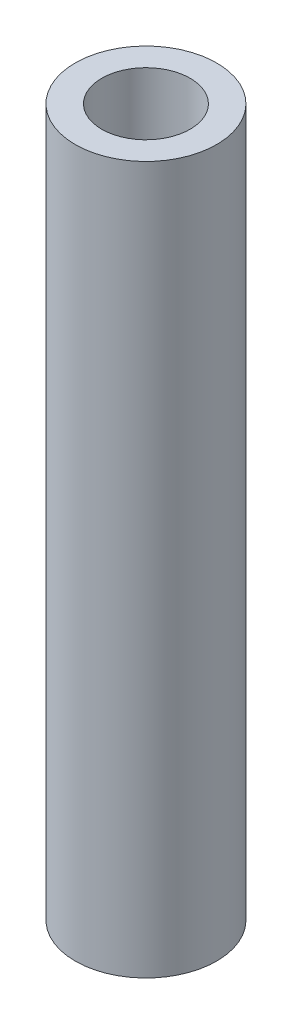
ISO-10303-21;
HEADER;
FILE_DESCRIPTION(('STEP AP214'),'2;1');
FILE_NAME('part.step','',(''),(''),'','','');
FILE_SCHEMA(('AUTOMOTIVE_DESIGN { 1 0 10303 214 1 1 1 1 }'));
ENDSEC;
DATA;
#1=APPLICATION_CONTEXT('core data for automotive mechanical design processes');
#2=APPLICATION_PROTOCOL_DEFINITION('international standard','automotive_design',2000,#1);
#3=PRODUCT_CONTEXT('',#1,'mechanical');
#4=PRODUCT('Part','Part','',(#3));
#5=PRODUCT_RELATED_PRODUCT_CATEGORY('part','',(#4));
#6=PRODUCT_DEFINITION_FORMATION('','',#4);
#7=PRODUCT_DEFINITION_CONTEXT('part definition',#1,'design');
#8=PRODUCT_DEFINITION('design','',#6,#7);
#9=PRODUCT_DEFINITION_SHAPE('','',#8);
#10=(LENGTH_UNIT() NAMED_UNIT(*) SI_UNIT(.MILLI.,.METRE.));
#11=(NAMED_UNIT(*) PLANE_ANGLE_UNIT() SI_UNIT($,.RADIAN.));
#12=(NAMED_UNIT(*) SI_UNIT($,.STERADIAN.) SOLID_ANGLE_UNIT());
#13=UNCERTAINTY_MEASURE_WITH_UNIT(LENGTH_MEASURE(1.E-05),#10,'distance_accuracy_value','');
#14=(GEOMETRIC_REPRESENTATION_CONTEXT(3) GLOBAL_UNCERTAINTY_ASSIGNED_CONTEXT((#13)) GLOBAL_UNIT_ASSIGNED_CONTEXT((#10,
#11,#12)) REPRESENTATION_CONTEXT('',''));
#15=CARTESIAN_POINT('',(0.,0.,0.));
#16=DIRECTION('',(0.,0.,1.));
#17=DIRECTION('',(1.,0.,0.));
#18=AXIS2_PLACEMENT_3D('',#15,#16,#17);
#19=CARTESIAN_POINT('',(0.,20.,0.));
#20=DIRECTION('',(0.,1.,0.));
#21=DIRECTION('',(0.,0.,1.));
#22=AXIS2_PLACEMENT_3D('',#19,#20,#21);
#23=PLANE('',#22);
#24=CARTESIAN_POINT('',(0.,20.,0.));
#25=DIRECTION('',(0.,1.,0.));
#26=DIRECTION('',(0.,0.,1.));
#27=AXIS2_PLACEMENT_3D('',#24,#25,#26);
#28=CIRCLE('',#27,2.);
#29=CARTESIAN_POINT('',(0.,20.,2.));
#30=VERTEX_POINT('',#29);
#31=EDGE_CURVE('E10',#30,#30,#28,.T.);
#32=ORIENTED_EDGE('',*,*,#31,.T.);
#33=EDGE_LOOP('',(#32));
#34=FACE_BOUND('',#33,.T.);
#35=CARTESIAN_POINT('',(0.,20.,0.));
#36=DIRECTION('',(0.,1.,0.));
#37=DIRECTION('',(0.,0.,1.));
#38=AXIS2_PLACEMENT_3D('',#35,#36,#37);
#39=CIRCLE('',#38,1.25);
#40=CARTESIAN_POINT('',(0.,20.,1.25));
#41=VERTEX_POINT('',#40);
#42=EDGE_CURVE('E49',#41,#41,#39,.T.);
#43=ORIENTED_EDGE('',*,*,#42,.F.);
#44=EDGE_LOOP('',(#43));
#45=FACE_BOUND('',#44,.T.);
#46=ADVANCED_FACE('F38',(#34,#45),#23,.T.);
#47=CARTESIAN_POINT('',(0.,0.,0.));
#48=DIRECTION('',(0.,1.,0.));
#49=DIRECTION('',(0.,0.,1.));
#50=AXIS2_PLACEMENT_3D('',#47,#48,#49);
#51=PLANE('',#50);
#52=CARTESIAN_POINT('',(0.,0.,0.));
#53=DIRECTION('',(0.,1.,0.));
#54=DIRECTION('',(0.,0.,1.));
#55=AXIS2_PLACEMENT_3D('',#52,#53,#54);
#56=CIRCLE('',#55,2.);
#57=CARTESIAN_POINT('',(0.,0.,2.));
#58=VERTEX_POINT('',#57);
#59=EDGE_CURVE('E42',#58,#58,#56,.T.);
#60=ORIENTED_EDGE('',*,*,#59,.F.);
#61=EDGE_LOOP('',(#60));
#62=FACE_BOUND('',#61,.T.);
#63=CARTESIAN_POINT('',(0.,0.,0.));
#64=DIRECTION('',(0.,1.,0.));
#65=DIRECTION('',(0.,0.,1.));
#66=AXIS2_PLACEMENT_3D('',#63,#64,#65);
#67=CIRCLE('',#66,1.25);
#68=CARTESIAN_POINT('',(0.,0.,1.25));
#69=VERTEX_POINT('',#68);
#70=EDGE_CURVE('E51',#69,#69,#67,.T.);
#71=ORIENTED_EDGE('',*,*,#70,.T.);
#72=EDGE_LOOP('',(#71));
#73=FACE_BOUND('',#72,.T.);
#74=ADVANCED_FACE('F61',(#62,#73),#51,.F.);
#75=CARTESIAN_POINT('',(0.,20.,0.));
#76=DIRECTION('',(0.,-1.,0.));
#77=DIRECTION('',(0.,0.,-1.));
#78=AXIS2_PLACEMENT_3D('',#75,#76,#77);
#79=CYLINDRICAL_SURFACE('',#78,2.);
#80=ORIENTED_EDGE('',*,*,#31,.F.);
#81=EDGE_LOOP('',(#80));
#82=FACE_BOUND('',#81,.T.);
#83=ORIENTED_EDGE('',*,*,#59,.T.);
#84=EDGE_LOOP('',(#83));
#85=FACE_BOUND('',#84,.T.);
#86=ADVANCED_FACE('F40',(#82,#85),#79,.T.);
#87=CARTESIAN_POINT('',(0.,20.,0.));
#88=DIRECTION('',(0.,-1.,0.));
#89=DIRECTION('',(0.,0.,-1.));
#90=AXIS2_PLACEMENT_3D('',#87,#88,#89);
#91=CYLINDRICAL_SURFACE('',#90,1.25);
#92=ORIENTED_EDGE('',*,*,#42,.T.);
#93=EDGE_LOOP('',(#92));
#94=FACE_BOUND('',#93,.T.);
#95=ORIENTED_EDGE('',*,*,#70,.F.);
#96=EDGE_LOOP('',(#95));
#97=FACE_BOUND('',#96,.T.);
#98=ADVANCED_FACE('F57',(#94,#97),#91,.F.);
#99=CLOSED_SHELL('',(#46,#74,#86,#98));
#100=MANIFOLD_SOLID_BREP('B2',#99);
#101=ADVANCED_BREP_SHAPE_REPRESENTATION('',(#18,#100),#14);
#102=SHAPE_DEFINITION_REPRESENTATION(#9,#101);
ENDSEC;
END-ISO-10303-21;
